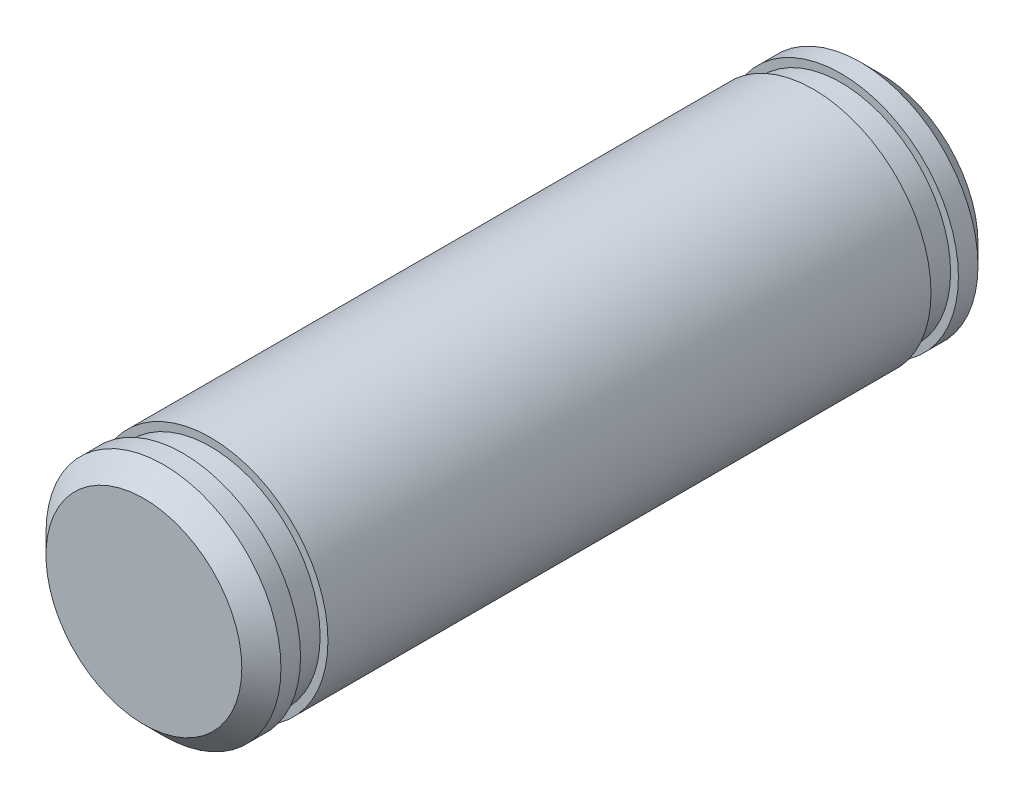
ISO-10303-21;
HEADER;
FILE_DESCRIPTION(('STEP AP214'),'2;1');
FILE_NAME('part.step','',(''),(''),'','','');
FILE_SCHEMA(('AUTOMOTIVE_DESIGN { 1 0 10303 214 1 1 1 1 }'));
ENDSEC;
DATA;
#1=APPLICATION_CONTEXT('core data for automotive mechanical design processes');
#2=APPLICATION_PROTOCOL_DEFINITION('international standard','automotive_design',2000,#1);
#3=PRODUCT_CONTEXT('',#1,'mechanical');
#4=PRODUCT('Part','Part','',(#3));
#5=PRODUCT_RELATED_PRODUCT_CATEGORY('part','',(#4));
#6=PRODUCT_DEFINITION_FORMATION('','',#4);
#7=PRODUCT_DEFINITION_CONTEXT('part definition',#1,'design');
#8=PRODUCT_DEFINITION('design','',#6,#7);
#9=PRODUCT_DEFINITION_SHAPE('','',#8);
#10=(LENGTH_UNIT() NAMED_UNIT(*) SI_UNIT(.MILLI.,.METRE.));
#11=(NAMED_UNIT(*) PLANE_ANGLE_UNIT() SI_UNIT($,.RADIAN.));
#12=(NAMED_UNIT(*) SI_UNIT($,.STERADIAN.) SOLID_ANGLE_UNIT());
#13=UNCERTAINTY_MEASURE_WITH_UNIT(LENGTH_MEASURE(1.E-05),#10,'distance_accuracy_value','');
#14=(GEOMETRIC_REPRESENTATION_CONTEXT(3) GLOBAL_UNCERTAINTY_ASSIGNED_CONTEXT((#13)) GLOBAL_UNIT_ASSIGNED_CONTEXT((#10,
#11,#12)) REPRESENTATION_CONTEXT('',''));
#15=CARTESIAN_POINT('',(0.,0.,0.));
#16=DIRECTION('',(0.,0.,1.));
#17=DIRECTION('',(1.,0.,0.));
#18=AXIS2_PLACEMENT_3D('',#15,#16,#17);
#19=CARTESIAN_POINT('',(0.,0.,18.8));
#20=DIRECTION('',(0.,0.,-1.));
#21=DIRECTION('',(-1.,0.,0.));
#22=AXIS2_PLACEMENT_3D('',#19,#20,#21);
#23=CYLINDRICAL_SURFACE('',#22,3.);
#24=CARTESIAN_POINT('',(0.,0.,1.7));
#25=DIRECTION('',(0.,0.,1.));
#26=DIRECTION('',(1.,0.,0.));
#27=AXIS2_PLACEMENT_3D('',#24,#25,#26);
#28=CIRCLE('',#27,3.);
#29=CARTESIAN_POINT('',(3.,0.,1.7));
#30=VERTEX_POINT('',#29);
#31=EDGE_CURVE('E64',#30,#30,#28,.T.);
#32=ORIENTED_EDGE('',*,*,#31,.T.);
#33=EDGE_LOOP('',(#32));
#34=FACE_BOUND('',#33,.T.);
#35=CARTESIAN_POINT('',(0.,0.,17.1));
#36=DIRECTION('',(0.,0.,1.));
#37=DIRECTION('',(1.,0.,0.));
#38=AXIS2_PLACEMENT_3D('',#35,#36,#37);
#39=CIRCLE('',#38,3.);
#40=CARTESIAN_POINT('',(3.,0.,17.1));
#41=VERTEX_POINT('',#40);
#42=EDGE_CURVE('E54',#41,#41,#39,.T.);
#43=ORIENTED_EDGE('',*,*,#42,.F.);
#44=EDGE_LOOP('',(#43));
#45=FACE_BOUND('',#44,.T.);
#46=ADVANCED_FACE('F33',(#34,#45),#23,.T.);
#47=CARTESIAN_POINT('',(0.,0.,17.1));
#48=DIRECTION('',(0.,0.,1.));
#49=DIRECTION('',(1.,0.,0.));
#50=AXIS2_PLACEMENT_3D('',#47,#48,#49);
#51=PLANE('',#50);
#52=CARTESIAN_POINT('',(0.,0.,17.1));
#53=DIRECTION('',(0.,0.,1.));
#54=DIRECTION('',(1.,0.,0.));
#55=AXIS2_PLACEMENT_3D('',#52,#53,#54);
#56=CIRCLE('',#55,2.8);
#57=CARTESIAN_POINT('',(2.8,0.,17.1));
#58=VERTEX_POINT('',#57);
#59=EDGE_CURVE('E58',#58,#58,#56,.T.);
#60=ORIENTED_EDGE('',*,*,#59,.F.);
#61=EDGE_LOOP('',(#60));
#62=FACE_BOUND('',#61,.T.);
#63=ORIENTED_EDGE('',*,*,#42,.T.);
#64=EDGE_LOOP('',(#63));
#65=FACE_BOUND('',#64,.T.);
#66=ADVANCED_FACE('F100',(#62,#65),#51,.T.);
#67=CARTESIAN_POINT('',(0.,0.,17.8));
#68=DIRECTION('',(0.,0.,1.));
#69=DIRECTION('',(1.,0.,0.));
#70=AXIS2_PLACEMENT_3D('',#67,#68,#69);
#71=PLANE('',#70);
#72=CARTESIAN_POINT('',(0.,0.,17.8));
#73=DIRECTION('',(0.,0.,1.));
#74=DIRECTION('',(1.,0.,0.));
#75=AXIS2_PLACEMENT_3D('',#72,#73,#74);
#76=CIRCLE('',#75,2.8);
#77=CARTESIAN_POINT('',(2.8,0.,17.8));
#78=VERTEX_POINT('',#77);
#79=EDGE_CURVE('E61',#78,#78,#76,.T.);
#80=ORIENTED_EDGE('',*,*,#79,.T.);
#81=EDGE_LOOP('',(#80));
#82=FACE_BOUND('',#81,.T.);
#83=CARTESIAN_POINT('',(0.,0.,17.8));
#84=DIRECTION('',(0.,0.,1.));
#85=DIRECTION('',(1.,0.,0.));
#86=AXIS2_PLACEMENT_3D('',#83,#84,#85);
#87=CIRCLE('',#86,3.);
#88=CARTESIAN_POINT('',(3.,0.,17.8));
#89=VERTEX_POINT('',#88);
#90=EDGE_CURVE('E55',#89,#89,#87,.T.);
#91=ORIENTED_EDGE('',*,*,#90,.F.);
#92=EDGE_LOOP('',(#91));
#93=FACE_BOUND('',#92,.T.);
#94=ADVANCED_FACE('F107',(#82,#93),#71,.F.);
#95=CARTESIAN_POINT('',(0.,0.,17.1));
#96=DIRECTION('',(0.,0.,1.));
#97=DIRECTION('',(1.,0.,0.));
#98=AXIS2_PLACEMENT_3D('',#95,#96,#97);
#99=CYLINDRICAL_SURFACE('',#98,2.8);
#100=ORIENTED_EDGE('',*,*,#59,.T.);
#101=EDGE_LOOP('',(#100));
#102=FACE_BOUND('',#101,.T.);
#103=ORIENTED_EDGE('',*,*,#79,.F.);
#104=EDGE_LOOP('',(#103));
#105=FACE_BOUND('',#104,.T.);
#106=ADVANCED_FACE('F132',(#102,#105),#99,.T.);
#107=CARTESIAN_POINT('',(0.,0.,18.8));
#108=DIRECTION('',(0.,0.,1.));
#109=DIRECTION('',(1.,0.,0.));
#110=AXIS2_PLACEMENT_3D('',#107,#108,#109);
#111=PLANE('',#110);
#112=CARTESIAN_POINT('',(0.,0.,18.8));
#113=DIRECTION('',(0.,0.,1.));
#114=DIRECTION('',(1.,0.,0.));
#115=AXIS2_PLACEMENT_3D('',#112,#113,#114);
#116=CIRCLE('',#115,2.5);
#117=CARTESIAN_POINT('',(2.5,0.,18.8));
#118=VERTEX_POINT('',#117);
#119=EDGE_CURVE('E41',#118,#118,#116,.T.);
#120=ORIENTED_EDGE('',*,*,#119,.T.);
#121=EDGE_LOOP('',(#120));
#122=FACE_BOUND('',#121,.T.);
#123=ADVANCED_FACE('F113',(#122),#111,.T.);
#124=CARTESIAN_POINT('',(0.,0.,18.3));
#125=DIRECTION('',(0.,0.,1.));
#126=DIRECTION('',(1.,0.,0.));
#127=AXIS2_PLACEMENT_3D('',#124,#125,#126);
#128=CIRCLE('',#127,3.);
#129=CARTESIAN_POINT('',(3.,0.,18.3));
#130=VERTEX_POINT('',#129);
#131=EDGE_CURVE('E10',#130,#130,#128,.F.);
#132=ORIENTED_EDGE('',*,*,#131,.T.);
#133=EDGE_LOOP('',(#132));
#134=FACE_BOUND('',#133,.T.);
#135=ORIENTED_EDGE('',*,*,#90,.T.);
#136=EDGE_LOOP('',(#135));
#137=FACE_BOUND('',#136,.T.);
#138=ADVANCED_FACE('F95',(#134,#137),#23,.T.);
#139=CARTESIAN_POINT('',(0.,0.,1.7));
#140=DIRECTION('',(0.,0.,1.));
#141=DIRECTION('',(1.,0.,0.));
#142=AXIS2_PLACEMENT_3D('',#139,#140,#141);
#143=PLANE('',#142);
#144=ORIENTED_EDGE('',*,*,#31,.F.);
#145=EDGE_LOOP('',(#144));
#146=FACE_BOUND('',#145,.T.);
#147=CARTESIAN_POINT('',(0.,0.,1.7));
#148=DIRECTION('',(0.,0.,1.));
#149=DIRECTION('',(1.,0.,0.));
#150=AXIS2_PLACEMENT_3D('',#147,#148,#149);
#151=CIRCLE('',#150,2.8);
#152=CARTESIAN_POINT('',(2.8,0.,1.7));
#153=VERTEX_POINT('',#152);
#154=EDGE_CURVE('E70',#153,#153,#151,.T.);
#155=ORIENTED_EDGE('',*,*,#154,.T.);
#156=EDGE_LOOP('',(#155));
#157=FACE_BOUND('',#156,.T.);
#158=ADVANCED_FACE('F79',(#146,#157),#143,.F.);
#159=CARTESIAN_POINT('',(0.,0.,1.));
#160=DIRECTION('',(0.,0.,1.));
#161=DIRECTION('',(1.,0.,0.));
#162=AXIS2_PLACEMENT_3D('',#159,#160,#161);
#163=PLANE('',#162);
#164=CARTESIAN_POINT('',(0.,0.,1.));
#165=DIRECTION('',(0.,0.,1.));
#166=DIRECTION('',(1.,0.,0.));
#167=AXIS2_PLACEMENT_3D('',#164,#165,#166);
#168=CIRCLE('',#167,3.);
#169=CARTESIAN_POINT('',(3.,0.,1.));
#170=VERTEX_POINT('',#169);
#171=EDGE_CURVE('E67',#170,#170,#168,.T.);
#172=ORIENTED_EDGE('',*,*,#171,.T.);
#173=EDGE_LOOP('',(#172));
#174=FACE_BOUND('',#173,.T.);
#175=CARTESIAN_POINT('',(0.,0.,1.));
#176=DIRECTION('',(0.,0.,1.));
#177=DIRECTION('',(1.,0.,0.));
#178=AXIS2_PLACEMENT_3D('',#175,#176,#177);
#179=CIRCLE('',#178,2.8);
#180=CARTESIAN_POINT('',(2.8,0.,1.));
#181=VERTEX_POINT('',#180);
#182=EDGE_CURVE('E73',#181,#181,#179,.T.);
#183=ORIENTED_EDGE('',*,*,#182,.F.);
#184=EDGE_LOOP('',(#183));
#185=FACE_BOUND('',#184,.T.);
#186=ADVANCED_FACE('F85',(#174,#185),#163,.T.);
#187=CARTESIAN_POINT('',(0.,0.,1.7));
#188=DIRECTION('',(0.,0.,-1.));
#189=DIRECTION('',(-1.,0.,0.));
#190=AXIS2_PLACEMENT_3D('',#187,#188,#189);
#191=CYLINDRICAL_SURFACE('',#190,2.8);
#192=ORIENTED_EDGE('',*,*,#154,.F.);
#193=EDGE_LOOP('',(#192));
#194=FACE_BOUND('',#193,.T.);
#195=ORIENTED_EDGE('',*,*,#182,.T.);
#196=EDGE_LOOP('',(#195));
#197=FACE_BOUND('',#196,.T.);
#198=ADVANCED_FACE('F81',(#194,#197),#191,.T.);
#199=CARTESIAN_POINT('',(0.,0.,0.));
#200=DIRECTION('',(0.,0.,1.));
#201=DIRECTION('',(1.,0.,0.));
#202=AXIS2_PLACEMENT_3D('',#199,#200,#201);
#203=PLANE('',#202);
#204=CARTESIAN_POINT('',(0.,0.,0.));
#205=DIRECTION('',(0.,0.,1.));
#206=DIRECTION('',(1.,0.,0.));
#207=AXIS2_PLACEMENT_3D('',#204,#205,#206);
#208=CIRCLE('',#207,2.49999999999999);
#209=CARTESIAN_POINT('',(2.49999999999999,0.,0.));
#210=VERTEX_POINT('',#209);
#211=EDGE_CURVE('E45',#210,#210,#208,.F.);
#212=ORIENTED_EDGE('',*,*,#211,.T.);
#213=EDGE_LOOP('',(#212));
#214=FACE_BOUND('',#213,.T.);
#215=ADVANCED_FACE('F84',(#214),#203,.F.);
#216=CARTESIAN_POINT('',(0.,0.,0.500000000000007));
#217=DIRECTION('',(0.,0.,1.));
#218=DIRECTION('',(1.,0.,0.));
#219=AXIS2_PLACEMENT_3D('',#216,#217,#218);
#220=CIRCLE('',#219,3.);
#221=CARTESIAN_POINT('',(3.,0.,0.500000000000007));
#222=VERTEX_POINT('',#221);
#223=EDGE_CURVE('E49',#222,#222,#220,.T.);
#224=ORIENTED_EDGE('',*,*,#223,.T.);
#225=EDGE_LOOP('',(#224));
#226=FACE_BOUND('',#225,.T.);
#227=ORIENTED_EDGE('',*,*,#171,.F.);
#228=EDGE_LOOP('',(#227));
#229=FACE_BOUND('',#228,.T.);
#230=ADVANCED_FACE('F103',(#226,#229),#23,.T.);
#231=CARTESIAN_POINT('',(0.,0.,0.500000000000007));
#232=DIRECTION('',(0.,0.,1.));
#233=DIRECTION('',(1.,0.,0.));
#234=AXIS2_PLACEMENT_3D('',#231,#232,#233);
#235=CONICAL_SURFACE('',#234,3.,0.785398163397447);
#236=ORIENTED_EDGE('',*,*,#211,.F.);
#237=EDGE_LOOP('',(#236));
#238=FACE_BOUND('',#237,.T.);
#239=ORIENTED_EDGE('',*,*,#223,.F.);
#240=EDGE_LOOP('',(#239));
#241=FACE_BOUND('',#240,.T.);
#242=ADVANCED_FACE('F115',(#238,#241),#235,.T.);
#243=CARTESIAN_POINT('',(0.,0.,18.8));
#244=DIRECTION('',(0.,0.,-1.));
#245=DIRECTION('',(-1.,0.,0.));
#246=AXIS2_PLACEMENT_3D('',#243,#244,#245);
#247=CONICAL_SURFACE('',#246,2.5,0.785398163397455);
#248=ORIENTED_EDGE('',*,*,#131,.F.);
#249=EDGE_LOOP('',(#248));
#250=FACE_BOUND('',#249,.T.);
#251=ORIENTED_EDGE('',*,*,#119,.F.);
#252=EDGE_LOOP('',(#251));
#253=FACE_BOUND('',#252,.T.);
#254=ADVANCED_FACE('F36',(#250,#253),#247,.T.);
#255=CLOSED_SHELL('',(#46,#66,#94,#106,#123,#138,#158,#186,#198,#215,#230,#242,#254));
#256=MANIFOLD_SOLID_BREP('B2',#255);
#257=ADVANCED_BREP_SHAPE_REPRESENTATION('',(#18,#256),#14);
#258=SHAPE_DEFINITION_REPRESENTATION(#9,#257);
ENDSEC;
END-ISO-10303-21;
